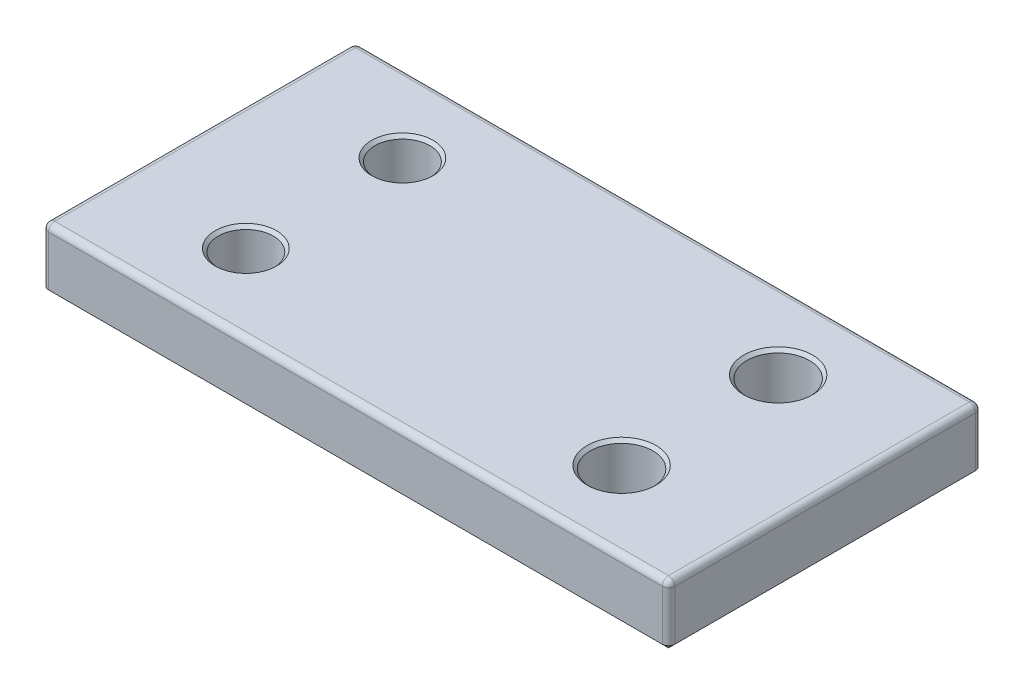
ISO-10303-21;
HEADER;
FILE_DESCRIPTION(('STEP AP214'),'2;1');
FILE_NAME('part.step','',(''),(''),'','','');
FILE_SCHEMA(('AUTOMOTIVE_DESIGN { 1 0 10303 214 1 1 1 1 }'));
ENDSEC;
DATA;
#1=APPLICATION_CONTEXT('core data for automotive mechanical design processes');
#2=APPLICATION_PROTOCOL_DEFINITION('international standard','automotive_design',2000,#1);
#3=PRODUCT_CONTEXT('',#1,'mechanical');
#4=PRODUCT('Part','Part','',(#3));
#5=PRODUCT_RELATED_PRODUCT_CATEGORY('part','',(#4));
#6=PRODUCT_DEFINITION_FORMATION('','',#4);
#7=PRODUCT_DEFINITION_CONTEXT('part definition',#1,'design');
#8=PRODUCT_DEFINITION('design','',#6,#7);
#9=PRODUCT_DEFINITION_SHAPE('','',#8);
#10=(LENGTH_UNIT() NAMED_UNIT(*) SI_UNIT(.MILLI.,.METRE.));
#11=(NAMED_UNIT(*) PLANE_ANGLE_UNIT() SI_UNIT($,.RADIAN.));
#12=(NAMED_UNIT(*) SI_UNIT($,.STERADIAN.) SOLID_ANGLE_UNIT());
#13=UNCERTAINTY_MEASURE_WITH_UNIT(LENGTH_MEASURE(1.E-05),#10,'distance_accuracy_value','');
#14=(GEOMETRIC_REPRESENTATION_CONTEXT(3) GLOBAL_UNCERTAINTY_ASSIGNED_CONTEXT((#13)) GLOBAL_UNIT_ASSIGNED_CONTEXT((#10,
#11,#12)) REPRESENTATION_CONTEXT('',''));
#15=CARTESIAN_POINT('',(0.,0.,0.));
#16=DIRECTION('',(0.,0.,1.));
#17=DIRECTION('',(1.,0.,0.));
#18=AXIS2_PLACEMENT_3D('',#15,#16,#17);
#19=CARTESIAN_POINT('',(-49.,5.,-24.));
#20=DIRECTION('',(0.,-1.,0.));
#21=DIRECTION('',(0.,0.,-1.));
#22=AXIS2_PLACEMENT_3D('',#19,#20,#21);
#23=CYLINDRICAL_SURFACE('',#22,1.);
#24=DIRECTION('',(0.,-1.,0.));
#25=VECTOR('',#24,1.);
#26=CARTESIAN_POINT('',(-49.,5.,-25.));
#27=LINE('',#26,#25);
#28=CARTESIAN_POINT('',(-49.,4.,-25.));
#29=VERTEX_POINT('',#28);
#30=CARTESIAN_POINT('',(-49.,-4.,-25.));
#31=VERTEX_POINT('',#30);
#32=EDGE_CURVE('E206',#29,#31,#27,.T.);
#33=ORIENTED_EDGE('',*,*,#32,.T.);
#34=CARTESIAN_POINT('',(-49.,-4.,-24.));
#35=DIRECTION('',(0.,1.,0.));
#36=DIRECTION('',(0.,0.,1.));
#37=AXIS2_PLACEMENT_3D('',#34,#35,#36);
#38=CIRCLE('',#37,1.);
#39=CARTESIAN_POINT('',(-50.,-4.,-24.));
#40=VERTEX_POINT('',#39);
#41=EDGE_CURVE('E228',#31,#40,#38,.T.);
#42=ORIENTED_EDGE('',*,*,#41,.T.);
#43=DIRECTION('',(0.,-1.,0.));
#44=VECTOR('',#43,1.);
#45=CARTESIAN_POINT('',(-50.,5.,-24.));
#46=LINE('',#45,#44);
#47=CARTESIAN_POINT('',(-50.,4.,-24.));
#48=VERTEX_POINT('',#47);
#49=EDGE_CURVE('E168',#48,#40,#46,.T.);
#50=ORIENTED_EDGE('',*,*,#49,.F.);
#51=CARTESIAN_POINT('',(-49.,4.,-24.));
#52=DIRECTION('',(0.,-1.,0.));
#53=DIRECTION('',(0.,0.,-1.));
#54=AXIS2_PLACEMENT_3D('',#51,#52,#53);
#55=CIRCLE('',#54,1.);
#56=EDGE_CURVE('E155',#48,#29,#55,.T.);
#57=ORIENTED_EDGE('',*,*,#56,.T.);
#58=EDGE_LOOP('',(#33,#42,#50,#57));
#59=FACE_BOUND('',#58,.T.);
#60=ADVANCED_FACE('F45',(#59),#23,.T.);
#61=CARTESIAN_POINT('',(-50.,5.,-24.));
#62=DIRECTION('',(1.,0.,0.));
#63=DIRECTION('',(0.,0.,-1.));
#64=AXIS2_PLACEMENT_3D('',#61,#62,#63);
#65=PLANE('',#64);
#66=ORIENTED_EDGE('',*,*,#49,.T.);
#67=DIRECTION('',(0.,0.,1.));
#68=VECTOR('',#67,1.);
#69=CARTESIAN_POINT('',(-50.,-4.,-24.));
#70=LINE('',#69,#68);
#71=CARTESIAN_POINT('',(-50.,-4.,24.));
#72=VERTEX_POINT('',#71);
#73=EDGE_CURVE('E191',#40,#72,#70,.T.);
#74=ORIENTED_EDGE('',*,*,#73,.T.);
#75=DIRECTION('',(0.,-1.,0.));
#76=VECTOR('',#75,1.);
#77=CARTESIAN_POINT('',(-50.,5.,24.));
#78=LINE('',#77,#76);
#79=CARTESIAN_POINT('',(-50.,4.,24.));
#80=VERTEX_POINT('',#79);
#81=EDGE_CURVE('E441',#80,#72,#78,.T.);
#82=ORIENTED_EDGE('',*,*,#81,.F.);
#83=DIRECTION('',(0.,0.,1.));
#84=VECTOR('',#83,1.);
#85=CARTESIAN_POINT('',(-50.,4.,-24.));
#86=LINE('',#85,#84);
#87=EDGE_CURVE('E189',#80,#48,#86,.F.);
#88=ORIENTED_EDGE('',*,*,#87,.T.);
#89=EDGE_LOOP('',(#66,#74,#82,#88));
#90=FACE_BOUND('',#89,.T.);
#91=ADVANCED_FACE('F292',(#90),#65,.F.);
#92=CARTESIAN_POINT('',(-49.,5.,24.));
#93=DIRECTION('',(0.,-1.,0.));
#94=DIRECTION('',(0.,0.,-1.));
#95=AXIS2_PLACEMENT_3D('',#92,#93,#94);
#96=CYLINDRICAL_SURFACE('',#95,1.);
#97=ORIENTED_EDGE('',*,*,#81,.T.);
#98=CARTESIAN_POINT('',(-49.,-4.,24.));
#99=DIRECTION('',(0.,1.,0.));
#100=DIRECTION('',(0.,0.,1.));
#101=AXIS2_PLACEMENT_3D('',#98,#99,#100);
#102=CIRCLE('',#101,1.);
#103=CARTESIAN_POINT('',(-49.,-4.,25.));
#104=VERTEX_POINT('',#103);
#105=EDGE_CURVE('E218',#72,#104,#102,.T.);
#106=ORIENTED_EDGE('',*,*,#105,.T.);
#107=DIRECTION('',(0.,-1.,0.));
#108=VECTOR('',#107,1.);
#109=CARTESIAN_POINT('',(-49.,5.,25.));
#110=LINE('',#109,#108);
#111=CARTESIAN_POINT('',(-49.,4.,25.));
#112=VERTEX_POINT('',#111);
#113=EDGE_CURVE('E438',#112,#104,#110,.T.);
#114=ORIENTED_EDGE('',*,*,#113,.F.);
#115=CARTESIAN_POINT('',(-49.,4.,24.));
#116=DIRECTION('',(0.,-1.,0.));
#117=DIRECTION('',(0.,0.,-1.));
#118=AXIS2_PLACEMENT_3D('',#115,#116,#117);
#119=CIRCLE('',#118,1.);
#120=EDGE_CURVE('E187',#112,#80,#119,.T.);
#121=ORIENTED_EDGE('',*,*,#120,.T.);
#122=EDGE_LOOP('',(#97,#106,#114,#121));
#123=FACE_BOUND('',#122,.T.);
#124=ADVANCED_FACE('F299',(#123),#96,.T.);
#125=CARTESIAN_POINT('',(49.,5.,25.));
#126=DIRECTION('',(0.,0.,-1.));
#127=DIRECTION('',(-1.,0.,0.));
#128=AXIS2_PLACEMENT_3D('',#125,#126,#127);
#129=PLANE('',#128);
#130=ORIENTED_EDGE('',*,*,#113,.T.);
#131=DIRECTION('',(1.,0.,0.));
#132=VECTOR('',#131,1.);
#133=CARTESIAN_POINT('',(49.,-4.,25.));
#134=LINE('',#133,#132);
#135=CARTESIAN_POINT('',(49.,-4.,25.));
#136=VERTEX_POINT('',#135);
#137=EDGE_CURVE('E220',#104,#136,#134,.T.);
#138=ORIENTED_EDGE('',*,*,#137,.T.);
#139=DIRECTION('',(0.,-1.,0.));
#140=VECTOR('',#139,1.);
#141=CARTESIAN_POINT('',(49.,5.,25.));
#142=LINE('',#141,#140);
#143=CARTESIAN_POINT('',(49.,4.,25.));
#144=VERTEX_POINT('',#143);
#145=EDGE_CURVE('E435',#144,#136,#142,.T.);
#146=ORIENTED_EDGE('',*,*,#145,.F.);
#147=DIRECTION('',(1.,0.,0.));
#148=VECTOR('',#147,1.);
#149=CARTESIAN_POINT('',(-49.,4.,25.));
#150=LINE('',#149,#148);
#151=EDGE_CURVE('E185',#144,#112,#150,.F.);
#152=ORIENTED_EDGE('',*,*,#151,.T.);
#153=EDGE_LOOP('',(#130,#138,#146,#152));
#154=FACE_BOUND('',#153,.T.);
#155=ADVANCED_FACE('F473',(#154),#129,.F.);
#156=CARTESIAN_POINT('',(49.,5.,24.));
#157=DIRECTION('',(0.,-1.,0.));
#158=DIRECTION('',(0.,0.,-1.));
#159=AXIS2_PLACEMENT_3D('',#156,#157,#158);
#160=CYLINDRICAL_SURFACE('',#159,1.);
#161=ORIENTED_EDGE('',*,*,#145,.T.);
#162=CARTESIAN_POINT('',(49.,-4.,24.));
#163=DIRECTION('',(0.,1.,0.));
#164=DIRECTION('',(0.,0.,1.));
#165=AXIS2_PLACEMENT_3D('',#162,#163,#164);
#166=CIRCLE('',#165,1.);
#167=CARTESIAN_POINT('',(50.,-4.,24.));
#168=VERTEX_POINT('',#167);
#169=EDGE_CURVE('E222',#136,#168,#166,.T.);
#170=ORIENTED_EDGE('',*,*,#169,.T.);
#171=DIRECTION('',(0.,-1.,0.));
#172=VECTOR('',#171,1.);
#173=CARTESIAN_POINT('',(50.,5.,24.));
#174=LINE('',#173,#172);
#175=CARTESIAN_POINT('',(50.,4.,24.));
#176=VERTEX_POINT('',#175);
#177=EDGE_CURVE('E432',#176,#168,#174,.T.);
#178=ORIENTED_EDGE('',*,*,#177,.F.);
#179=CARTESIAN_POINT('',(49.,4.,24.));
#180=DIRECTION('',(0.,-1.,0.));
#181=DIRECTION('',(0.,0.,-1.));
#182=AXIS2_PLACEMENT_3D('',#179,#180,#181);
#183=CIRCLE('',#182,1.);
#184=EDGE_CURVE('E183',#176,#144,#183,.T.);
#185=ORIENTED_EDGE('',*,*,#184,.T.);
#186=EDGE_LOOP('',(#161,#170,#178,#185));
#187=FACE_BOUND('',#186,.T.);
#188=ADVANCED_FACE('F466',(#187),#160,.T.);
#189=CARTESIAN_POINT('',(50.,5.,-24.));
#190=DIRECTION('',(-1.,0.,0.));
#191=DIRECTION('',(0.,0.,1.));
#192=AXIS2_PLACEMENT_3D('',#189,#190,#191);
#193=PLANE('',#192);
#194=ORIENTED_EDGE('',*,*,#177,.T.);
#195=DIRECTION('',(0.,0.,-1.));
#196=VECTOR('',#195,1.);
#197=CARTESIAN_POINT('',(50.,-4.,-24.));
#198=LINE('',#197,#196);
#199=CARTESIAN_POINT('',(50.,-4.,-24.));
#200=VERTEX_POINT('',#199);
#201=EDGE_CURVE('E224',#168,#200,#198,.T.);
#202=ORIENTED_EDGE('',*,*,#201,.T.);
#203=DIRECTION('',(0.,-1.,0.));
#204=VECTOR('',#203,1.);
#205=CARTESIAN_POINT('',(50.,5.,-24.));
#206=LINE('',#205,#204);
#207=CARTESIAN_POINT('',(50.,4.,-24.));
#208=VERTEX_POINT('',#207);
#209=EDGE_CURVE('E430',#208,#200,#206,.T.);
#210=ORIENTED_EDGE('',*,*,#209,.F.);
#211=DIRECTION('',(0.,0.,-1.));
#212=VECTOR('',#211,1.);
#213=CARTESIAN_POINT('',(50.,4.,24.));
#214=LINE('',#213,#212);
#215=EDGE_CURVE('E181',#208,#176,#214,.F.);
#216=ORIENTED_EDGE('',*,*,#215,.T.);
#217=EDGE_LOOP('',(#194,#202,#210,#216));
#218=FACE_BOUND('',#217,.T.);
#219=ADVANCED_FACE('F459',(#218),#193,.F.);
#220=CARTESIAN_POINT('',(49.,5.,-24.));
#221=DIRECTION('',(0.,-1.,0.));
#222=DIRECTION('',(0.,0.,-1.));
#223=AXIS2_PLACEMENT_3D('',#220,#221,#222);
#224=CYLINDRICAL_SURFACE('',#223,1.);
#225=ORIENTED_EDGE('',*,*,#209,.T.);
#226=CARTESIAN_POINT('',(49.,-4.,-24.));
#227=DIRECTION('',(0.,1.,0.));
#228=DIRECTION('',(0.,0.,1.));
#229=AXIS2_PLACEMENT_3D('',#226,#227,#228);
#230=CIRCLE('',#229,1.);
#231=CARTESIAN_POINT('',(49.,-4.,-25.));
#232=VERTEX_POINT('',#231);
#233=EDGE_CURVE('E69',#200,#232,#230,.T.);
#234=ORIENTED_EDGE('',*,*,#233,.T.);
#235=DIRECTION('',(0.,-1.,0.));
#236=VECTOR('',#235,1.);
#237=CARTESIAN_POINT('',(49.,5.,-25.));
#238=LINE('',#237,#236);
#239=CARTESIAN_POINT('',(49.,4.,-25.));
#240=VERTEX_POINT('',#239);
#241=EDGE_CURVE('E428',#240,#232,#238,.T.);
#242=ORIENTED_EDGE('',*,*,#241,.F.);
#243=CARTESIAN_POINT('',(49.,4.,-24.));
#244=DIRECTION('',(0.,-1.,0.));
#245=DIRECTION('',(0.,0.,-1.));
#246=AXIS2_PLACEMENT_3D('',#243,#244,#245);
#247=CIRCLE('',#246,1.);
#248=EDGE_CURVE('E175',#240,#208,#247,.T.);
#249=ORIENTED_EDGE('',*,*,#248,.T.);
#250=EDGE_LOOP('',(#225,#234,#242,#249));
#251=FACE_BOUND('',#250,.T.);
#252=ADVANCED_FACE('F456',(#251),#224,.T.);
#253=CARTESIAN_POINT('',(49.,5.,-25.));
#254=DIRECTION('',(0.,0.,1.));
#255=DIRECTION('',(1.,0.,0.));
#256=AXIS2_PLACEMENT_3D('',#253,#254,#255);
#257=PLANE('',#256);
#258=ORIENTED_EDGE('',*,*,#241,.T.);
#259=DIRECTION('',(-1.,0.,0.));
#260=VECTOR('',#259,1.);
#261=CARTESIAN_POINT('',(49.,-4.,-25.));
#262=LINE('',#261,#260);
#263=EDGE_CURVE('E61',#232,#31,#262,.T.);
#264=ORIENTED_EDGE('',*,*,#263,.T.);
#265=ORIENTED_EDGE('',*,*,#32,.F.);
#266=DIRECTION('',(-1.,0.,0.));
#267=VECTOR('',#266,1.);
#268=CARTESIAN_POINT('',(49.,4.,-25.));
#269=LINE('',#268,#267);
#270=EDGE_CURVE('E145',#29,#240,#269,.F.);
#271=ORIENTED_EDGE('',*,*,#270,.T.);
#272=EDGE_LOOP('',(#258,#264,#265,#271));
#273=FACE_BOUND('',#272,.T.);
#274=ADVANCED_FACE('F454',(#273),#257,.F.);
#275=CARTESIAN_POINT('',(-49.,5.,-24.));
#276=DIRECTION('',(0.,1.,0.));
#277=DIRECTION('',(0.,0.,1.));
#278=AXIS2_PLACEMENT_3D('',#275,#276,#277);
#279=PLANE('',#278);
#280=CARTESIAN_POINT('',(30.,5.,12.5));
#281=DIRECTION('',(0.,1.,0.));
#282=DIRECTION('',(0.,0.,1.));
#283=AXIS2_PLACEMENT_3D('',#280,#281,#282);
#284=CIRCLE('',#283,5.49999999999998);
#285=CARTESIAN_POINT('',(30.,5.,18.));
#286=VERTEX_POINT('',#285);
#287=EDGE_CURVE('E264',#286,#286,#284,.F.);
#288=ORIENTED_EDGE('',*,*,#287,.T.);
#289=EDGE_LOOP('',(#288));
#290=FACE_BOUND('',#289,.T.);
#291=CARTESIAN_POINT('',(30.,5.,-12.5));
#292=DIRECTION('',(0.,1.,0.));
#293=DIRECTION('',(0.,0.,1.));
#294=AXIS2_PLACEMENT_3D('',#291,#292,#293);
#295=CIRCLE('',#294,5.49999999999999);
#296=CARTESIAN_POINT('',(30.,5.,-7.00000000000001));
#297=VERTEX_POINT('',#296);
#298=EDGE_CURVE('E261',#297,#297,#295,.F.);
#299=ORIENTED_EDGE('',*,*,#298,.T.);
#300=EDGE_LOOP('',(#299));
#301=FACE_BOUND('',#300,.T.);
#302=CARTESIAN_POINT('',(-30.,5.,12.5));
#303=DIRECTION('',(0.,1.,0.));
#304=DIRECTION('',(0.,0.,1.));
#305=AXIS2_PLACEMENT_3D('',#302,#303,#304);
#306=CIRCLE('',#305,4.89999999999996);
#307=CARTESIAN_POINT('',(-30.,5.,17.4));
#308=VERTEX_POINT('',#307);
#309=EDGE_CURVE('E258',#308,#308,#306,.F.);
#310=ORIENTED_EDGE('',*,*,#309,.T.);
#311=EDGE_LOOP('',(#310));
#312=FACE_BOUND('',#311,.T.);
#313=CARTESIAN_POINT('',(-30.,5.,-12.5));
#314=DIRECTION('',(0.,1.,0.));
#315=DIRECTION('',(0.,0.,1.));
#316=AXIS2_PLACEMENT_3D('',#313,#314,#315);
#317=CIRCLE('',#316,4.89999999999996);
#318=CARTESIAN_POINT('',(-30.,5.,-7.60000000000004));
#319=VERTEX_POINT('',#318);
#320=EDGE_CURVE('E255',#319,#319,#317,.F.);
#321=ORIENTED_EDGE('',*,*,#320,.T.);
#322=EDGE_LOOP('',(#321));
#323=FACE_BOUND('',#322,.T.);
#324=DIRECTION('',(0.,0.,-1.));
#325=VECTOR('',#324,1.);
#326=CARTESIAN_POINT('',(49.,5.,-24.));
#327=LINE('',#326,#325);
#328=CARTESIAN_POINT('',(49.,5.,24.));
#329=VERTEX_POINT('',#328);
#330=CARTESIAN_POINT('',(49.,5.,-24.));
#331=VERTEX_POINT('',#330);
#332=EDGE_CURVE('E172',#329,#331,#327,.T.);
#333=ORIENTED_EDGE('',*,*,#332,.T.);
#334=DIRECTION('',(-1.,0.,0.));
#335=VECTOR('',#334,1.);
#336=CARTESIAN_POINT('',(-49.,5.,-24.));
#337=LINE('',#336,#335);
#338=CARTESIAN_POINT('',(-49.,5.,-24.));
#339=VERTEX_POINT('',#338);
#340=EDGE_CURVE('E143',#331,#339,#337,.T.);
#341=ORIENTED_EDGE('',*,*,#340,.T.);
#342=DIRECTION('',(0.,0.,1.));
#343=VECTOR('',#342,1.);
#344=CARTESIAN_POINT('',(-49.,5.,24.));
#345=LINE('',#344,#343);
#346=CARTESIAN_POINT('',(-49.,5.,24.));
#347=VERTEX_POINT('',#346);
#348=EDGE_CURVE('E161',#339,#347,#345,.T.);
#349=ORIENTED_EDGE('',*,*,#348,.T.);
#350=DIRECTION('',(1.,0.,0.));
#351=VECTOR('',#350,1.);
#352=CARTESIAN_POINT('',(49.,5.,24.));
#353=LINE('',#352,#351);
#354=EDGE_CURVE('E167',#347,#329,#353,.T.);
#355=ORIENTED_EDGE('',*,*,#354,.T.);
#356=EDGE_LOOP('',(#333,#341,#349,#355));
#357=FACE_BOUND('',#356,.T.);
#358=ADVANCED_FACE('F170',(#290,#301,#312,#323,#357),#279,.T.);
#359=CARTESIAN_POINT('',(-49.,-5.,-24.));
#360=DIRECTION('',(0.,1.,0.));
#361=DIRECTION('',(0.,0.,1.));
#362=AXIS2_PLACEMENT_3D('',#359,#360,#361);
#363=PLANE('',#362);
#364=CARTESIAN_POINT('',(30.,-5.,-12.5));
#365=DIRECTION('',(0.,1.,0.));
#366=DIRECTION('',(0.,0.,1.));
#367=AXIS2_PLACEMENT_3D('',#364,#365,#366);
#368=CIRCLE('',#367,5.);
#369=CARTESIAN_POINT('',(30.,-5.,-7.5));
#370=VERTEX_POINT('',#369);
#371=EDGE_CURVE('E418',#370,#370,#368,.T.);
#372=ORIENTED_EDGE('',*,*,#371,.T.);
#373=EDGE_LOOP('',(#372));
#374=FACE_BOUND('',#373,.T.);
#375=CARTESIAN_POINT('',(30.,-5.,12.5));
#376=DIRECTION('',(0.,1.,0.));
#377=DIRECTION('',(0.,0.,1.));
#378=AXIS2_PLACEMENT_3D('',#375,#376,#377);
#379=CIRCLE('',#378,5.);
#380=CARTESIAN_POINT('',(30.,-5.,17.5));
#381=VERTEX_POINT('',#380);
#382=EDGE_CURVE('E415',#381,#381,#379,.T.);
#383=ORIENTED_EDGE('',*,*,#382,.T.);
#384=EDGE_LOOP('',(#383));
#385=FACE_BOUND('',#384,.T.);
#386=CARTESIAN_POINT('',(-30.,-5.,-12.5));
#387=DIRECTION('',(0.,1.,0.));
#388=DIRECTION('',(0.,0.,1.));
#389=AXIS2_PLACEMENT_3D('',#386,#387,#388);
#390=CIRCLE('',#389,4.39999999999999);
#391=CARTESIAN_POINT('',(-30.,-5.,-8.10000000000001));
#392=VERTEX_POINT('',#391);
#393=EDGE_CURVE('E417',#392,#392,#390,.T.);
#394=ORIENTED_EDGE('',*,*,#393,.T.);
#395=EDGE_LOOP('',(#394));
#396=FACE_BOUND('',#395,.T.);
#397=CARTESIAN_POINT('',(-30.,-5.,12.5));
#398=DIRECTION('',(0.,1.,0.));
#399=DIRECTION('',(0.,0.,1.));
#400=AXIS2_PLACEMENT_3D('',#397,#398,#399);
#401=CIRCLE('',#400,4.39999999999999);
#402=CARTESIAN_POINT('',(-30.,-5.,16.9));
#403=VERTEX_POINT('',#402);
#404=EDGE_CURVE('E234',#403,#403,#401,.T.);
#405=ORIENTED_EDGE('',*,*,#404,.T.);
#406=EDGE_LOOP('',(#405));
#407=FACE_BOUND('',#406,.T.);
#408=DIRECTION('',(-1.,0.,0.));
#409=VECTOR('',#408,1.);
#410=CARTESIAN_POINT('',(-49.,-5.,24.));
#411=LINE('',#410,#409);
#412=CARTESIAN_POINT('',(49.,-5.,24.));
#413=VERTEX_POINT('',#412);
#414=CARTESIAN_POINT('',(-49.,-5.,24.));
#415=VERTEX_POINT('',#414);
#416=EDGE_CURVE('E213',#413,#415,#411,.T.);
#417=ORIENTED_EDGE('',*,*,#416,.T.);
#418=DIRECTION('',(0.,0.,-1.));
#419=VECTOR('',#418,1.);
#420=CARTESIAN_POINT('',(-49.,-5.,-24.));
#421=LINE('',#420,#419);
#422=CARTESIAN_POINT('',(-49.,-5.,-24.));
#423=VERTEX_POINT('',#422);
#424=EDGE_CURVE('E215',#415,#423,#421,.T.);
#425=ORIENTED_EDGE('',*,*,#424,.T.);
#426=DIRECTION('',(1.,0.,0.));
#427=VECTOR('',#426,1.);
#428=CARTESIAN_POINT('',(-49.,-5.,-24.));
#429=LINE('',#428,#427);
#430=CARTESIAN_POINT('',(49.,-5.,-24.));
#431=VERTEX_POINT('',#430);
#432=EDGE_CURVE('E209',#423,#431,#429,.T.);
#433=ORIENTED_EDGE('',*,*,#432,.T.);
#434=DIRECTION('',(0.,0.,1.));
#435=VECTOR('',#434,1.);
#436=CARTESIAN_POINT('',(49.,-5.,-24.));
#437=LINE('',#436,#435);
#438=EDGE_CURVE('E211',#431,#413,#437,.T.);
#439=ORIENTED_EDGE('',*,*,#438,.T.);
#440=EDGE_LOOP('',(#417,#425,#433,#439));
#441=FACE_BOUND('',#440,.T.);
#442=ADVANCED_FACE('F329',(#374,#385,#396,#407,#441),#363,.F.);
#443=CARTESIAN_POINT('',(-49.,4.,24.));
#444=DIRECTION('',(-1.,0.,0.));
#445=DIRECTION('',(0.,0.,1.));
#446=AXIS2_PLACEMENT_3D('',#443,#444,#445);
#447=CYLINDRICAL_SURFACE('',#446,1.);
#448=CARTESIAN_POINT('',(-49.,4.,24.));
#449=DIRECTION('',(-1.,0.,0.));
#450=DIRECTION('',(0.,0.,1.));
#451=AXIS2_PLACEMENT_3D('',#448,#449,#450);
#452=CIRCLE('',#451,1.);
#453=EDGE_CURVE('E200',#112,#347,#452,.T.);
#454=ORIENTED_EDGE('',*,*,#453,.F.);
#455=ORIENTED_EDGE('',*,*,#151,.F.);
#456=CARTESIAN_POINT('',(49.,4.,24.));
#457=DIRECTION('',(1.,0.,0.));
#458=DIRECTION('',(0.,0.,-1.));
#459=AXIS2_PLACEMENT_3D('',#456,#457,#458);
#460=CIRCLE('',#459,1.);
#461=EDGE_CURVE('E203',#329,#144,#460,.T.);
#462=ORIENTED_EDGE('',*,*,#461,.F.);
#463=ORIENTED_EDGE('',*,*,#354,.F.);
#464=EDGE_LOOP('',(#454,#455,#462,#463));
#465=FACE_BOUND('',#464,.T.);
#466=ADVANCED_FACE('F325',(#465),#447,.T.);
#467=CARTESIAN_POINT('',(49.,4.,24.));
#468=DIRECTION('',(0.,1.,0.));
#469=DIRECTION('',(0.,0.,1.));
#470=AXIS2_PLACEMENT_3D('',#467,#468,#469);
#471=SPHERICAL_SURFACE('',#470,1.);
#472=ORIENTED_EDGE('',*,*,#461,.T.);
#473=ORIENTED_EDGE('',*,*,#184,.F.);
#474=CARTESIAN_POINT('',(49.,4.,24.));
#475=DIRECTION('',(0.,0.,-1.));
#476=DIRECTION('',(-1.,0.,0.));
#477=AXIS2_PLACEMENT_3D('',#474,#475,#476);
#478=CIRCLE('',#477,1.);
#479=EDGE_CURVE('E197',#329,#176,#478,.T.);
#480=ORIENTED_EDGE('',*,*,#479,.F.);
#481=EDGE_LOOP('',(#472,#473,#480));
#482=FACE_BOUND('',#481,.T.);
#483=ADVANCED_FACE('F321',(#482),#471,.T.);
#484=CARTESIAN_POINT('',(-49.,4.,24.));
#485=DIRECTION('',(0.,1.,0.));
#486=DIRECTION('',(0.,0.,1.));
#487=AXIS2_PLACEMENT_3D('',#484,#485,#486);
#488=SPHERICAL_SURFACE('',#487,1.);
#489=ORIENTED_EDGE('',*,*,#120,.F.);
#490=ORIENTED_EDGE('',*,*,#453,.T.);
#491=CARTESIAN_POINT('',(-49.,4.,24.));
#492=DIRECTION('',(0.,0.,-1.));
#493=DIRECTION('',(-1.,0.,0.));
#494=AXIS2_PLACEMENT_3D('',#491,#492,#493);
#495=CIRCLE('',#494,1.);
#496=EDGE_CURVE('E164',#80,#347,#495,.T.);
#497=ORIENTED_EDGE('',*,*,#496,.F.);
#498=EDGE_LOOP('',(#489,#490,#497));
#499=FACE_BOUND('',#498,.T.);
#500=ADVANCED_FACE('F317',(#499),#488,.T.);
#501=CARTESIAN_POINT('',(49.,4.,-24.));
#502=DIRECTION('',(0.,0.,1.));
#503=DIRECTION('',(1.,0.,0.));
#504=AXIS2_PLACEMENT_3D('',#501,#502,#503);
#505=CYLINDRICAL_SURFACE('',#504,1.);
#506=ORIENTED_EDGE('',*,*,#479,.T.);
#507=ORIENTED_EDGE('',*,*,#215,.F.);
#508=CARTESIAN_POINT('',(49.,4.,-24.));
#509=DIRECTION('',(0.,0.,-1.));
#510=DIRECTION('',(-1.,0.,0.));
#511=AXIS2_PLACEMENT_3D('',#508,#509,#510);
#512=CIRCLE('',#511,1.);
#513=EDGE_CURVE('E158',#331,#208,#512,.T.);
#514=ORIENTED_EDGE('',*,*,#513,.F.);
#515=ORIENTED_EDGE('',*,*,#332,.F.);
#516=EDGE_LOOP('',(#506,#507,#514,#515));
#517=FACE_BOUND('',#516,.T.);
#518=ADVANCED_FACE('F314',(#517),#505,.T.);
#519=CARTESIAN_POINT('',(-49.,4.,-24.));
#520=DIRECTION('',(0.,0.,-1.));
#521=DIRECTION('',(-1.,0.,0.));
#522=AXIS2_PLACEMENT_3D('',#519,#520,#521);
#523=CYLINDRICAL_SURFACE('',#522,1.);
#524=ORIENTED_EDGE('',*,*,#496,.T.);
#525=ORIENTED_EDGE('',*,*,#348,.F.);
#526=CARTESIAN_POINT('',(-49.,4.,-24.));
#527=DIRECTION('',(0.,0.,-1.));
#528=DIRECTION('',(-1.,0.,0.));
#529=AXIS2_PLACEMENT_3D('',#526,#527,#528);
#530=CIRCLE('',#529,1.);
#531=EDGE_CURVE('E152',#48,#339,#530,.T.);
#532=ORIENTED_EDGE('',*,*,#531,.F.);
#533=ORIENTED_EDGE('',*,*,#87,.F.);
#534=EDGE_LOOP('',(#524,#525,#532,#533));
#535=FACE_BOUND('',#534,.T.);
#536=ADVANCED_FACE('F162',(#535),#523,.T.);
#537=CARTESIAN_POINT('',(49.,4.,-24.));
#538=DIRECTION('',(0.,1.,0.));
#539=DIRECTION('',(0.,0.,1.));
#540=AXIS2_PLACEMENT_3D('',#537,#538,#539);
#541=SPHERICAL_SURFACE('',#540,1.);
#542=ORIENTED_EDGE('',*,*,#513,.T.);
#543=ORIENTED_EDGE('',*,*,#248,.F.);
#544=CARTESIAN_POINT('',(49.,4.,-24.));
#545=DIRECTION('',(-1.,0.,0.));
#546=DIRECTION('',(0.,0.,1.));
#547=AXIS2_PLACEMENT_3D('',#544,#545,#546);
#548=CIRCLE('',#547,1.);
#549=EDGE_CURVE('E148',#331,#240,#548,.T.);
#550=ORIENTED_EDGE('',*,*,#549,.F.);
#551=EDGE_LOOP('',(#542,#543,#550));
#552=FACE_BOUND('',#551,.T.);
#553=ADVANCED_FACE('F308',(#552),#541,.T.);
#554=CARTESIAN_POINT('',(-49.,4.,-24.));
#555=DIRECTION('',(0.,1.,0.));
#556=DIRECTION('',(0.,0.,1.));
#557=AXIS2_PLACEMENT_3D('',#554,#555,#556);
#558=SPHERICAL_SURFACE('',#557,1.);
#559=ORIENTED_EDGE('',*,*,#56,.F.);
#560=ORIENTED_EDGE('',*,*,#531,.T.);
#561=CARTESIAN_POINT('',(-49.,4.,-24.));
#562=DIRECTION('',(1.,0.,0.));
#563=DIRECTION('',(0.,0.,-1.));
#564=AXIS2_PLACEMENT_3D('',#561,#562,#563);
#565=CIRCLE('',#564,1.);
#566=EDGE_CURVE('E139',#29,#339,#565,.T.);
#567=ORIENTED_EDGE('',*,*,#566,.F.);
#568=EDGE_LOOP('',(#559,#560,#567));
#569=FACE_BOUND('',#568,.T.);
#570=ADVANCED_FACE('F154',(#569),#558,.T.);
#571=CARTESIAN_POINT('',(-49.,4.,-24.));
#572=DIRECTION('',(1.,0.,0.));
#573=DIRECTION('',(0.,0.,-1.));
#574=AXIS2_PLACEMENT_3D('',#571,#572,#573);
#575=CYLINDRICAL_SURFACE('',#574,1.);
#576=ORIENTED_EDGE('',*,*,#549,.T.);
#577=ORIENTED_EDGE('',*,*,#270,.F.);
#578=ORIENTED_EDGE('',*,*,#566,.T.);
#579=ORIENTED_EDGE('',*,*,#340,.F.);
#580=EDGE_LOOP('',(#576,#577,#578,#579));
#581=FACE_BOUND('',#580,.T.);
#582=ADVANCED_FACE('F141',(#581),#575,.T.);
#583=CARTESIAN_POINT('',(50.,-4.,-24.));
#584=DIRECTION('',(-0.707106781186546,0.707106781186549,0.));
#585=DIRECTION('',(0.,0.,-1.));
#586=AXIS2_PLACEMENT_3D('',#583,#584,#585);
#587=PLANE('',#586);
#588=DIRECTION('',(-0.707106781186549,-0.707106781186546,0.));
#589=VECTOR('',#588,1.);
#590=CARTESIAN_POINT('',(50.,-4.,-24.));
#591=LINE('',#590,#589);
#592=EDGE_CURVE('E149',#200,#431,#591,.T.);
#593=ORIENTED_EDGE('',*,*,#592,.F.);
#594=ORIENTED_EDGE('',*,*,#201,.F.);
#595=DIRECTION('',(0.707106781186549,0.707106781186546,0.));
#596=VECTOR('',#595,1.);
#597=CARTESIAN_POINT('',(49.,-5.,24.));
#598=LINE('',#597,#596);
#599=EDGE_CURVE('E248',#413,#168,#598,.T.);
#600=ORIENTED_EDGE('',*,*,#599,.F.);
#601=ORIENTED_EDGE('',*,*,#438,.F.);
#602=EDGE_LOOP('',(#593,#594,#600,#601));
#603=FACE_BOUND('',#602,.T.);
#604=ADVANCED_FACE('F305',(#603),#587,.F.);
#605=CARTESIAN_POINT('',(49.,-4.,-24.));
#606=DIRECTION('',(0.,1.,0.));
#607=DIRECTION('',(0.,0.,1.));
#608=AXIS2_PLACEMENT_3D('',#605,#606,#607);
#609=CONICAL_SURFACE('',#608,1.,0.78539816339745);
#610=ORIENTED_EDGE('',*,*,#233,.F.);
#611=ORIENTED_EDGE('',*,*,#592,.T.);
#612=DIRECTION('',(0.,-0.707106781186546,0.707106781186549));
#613=VECTOR('',#612,1.);
#614=CARTESIAN_POINT('',(49.,-4.,-25.));
#615=LINE('',#614,#613);
#616=EDGE_CURVE('E245',#232,#431,#615,.T.);
#617=ORIENTED_EDGE('',*,*,#616,.F.);
#618=EDGE_LOOP('',(#610,#611,#617));
#619=FACE_BOUND('',#618,.T.);
#620=ADVANCED_FACE('F374',(#619),#609,.T.);
#621=CARTESIAN_POINT('',(49.,-4.,24.));
#622=DIRECTION('',(0.,1.,0.));
#623=DIRECTION('',(0.,0.,1.));
#624=AXIS2_PLACEMENT_3D('',#621,#622,#623);
#625=CONICAL_SURFACE('',#624,1.,0.78539816339745);
#626=ORIENTED_EDGE('',*,*,#599,.T.);
#627=ORIENTED_EDGE('',*,*,#169,.F.);
#628=DIRECTION('',(0.,0.707106781186546,0.707106781186549));
#629=VECTOR('',#628,1.);
#630=CARTESIAN_POINT('',(49.,-5.,24.));
#631=LINE('',#630,#629);
#632=EDGE_CURVE('E242',#413,#136,#631,.T.);
#633=ORIENTED_EDGE('',*,*,#632,.F.);
#634=EDGE_LOOP('',(#626,#627,#633));
#635=FACE_BOUND('',#634,.T.);
#636=ADVANCED_FACE('F367',(#635),#625,.T.);
#637=CARTESIAN_POINT('',(49.,-4.,-25.));
#638=DIRECTION('',(0.,0.707106781186549,0.707106781186546));
#639=DIRECTION('',(-1.,0.,0.));
#640=AXIS2_PLACEMENT_3D('',#637,#638,#639);
#641=PLANE('',#640);
#642=ORIENTED_EDGE('',*,*,#616,.T.);
#643=ORIENTED_EDGE('',*,*,#432,.F.);
#644=DIRECTION('',(0.,-0.707106781186546,0.707106781186549));
#645=VECTOR('',#644,1.);
#646=CARTESIAN_POINT('',(-49.,-4.,-25.));
#647=LINE('',#646,#645);
#648=EDGE_CURVE('E239',#31,#423,#647,.T.);
#649=ORIENTED_EDGE('',*,*,#648,.F.);
#650=ORIENTED_EDGE('',*,*,#263,.F.);
#651=EDGE_LOOP('',(#642,#643,#649,#650));
#652=FACE_BOUND('',#651,.T.);
#653=ADVANCED_FACE('F360',(#652),#641,.F.);
#654=CARTESIAN_POINT('',(49.,-4.,25.));
#655=DIRECTION('',(0.,0.707106781186549,-0.707106781186546));
#656=DIRECTION('',(1.,0.,0.));
#657=AXIS2_PLACEMENT_3D('',#654,#655,#656);
#658=PLANE('',#657);
#659=ORIENTED_EDGE('',*,*,#632,.T.);
#660=ORIENTED_EDGE('',*,*,#137,.F.);
#661=DIRECTION('',(0.,0.707106781186546,0.707106781186549));
#662=VECTOR('',#661,1.);
#663=CARTESIAN_POINT('',(-49.,-5.,24.));
#664=LINE('',#663,#662);
#665=EDGE_CURVE('E236',#415,#104,#664,.T.);
#666=ORIENTED_EDGE('',*,*,#665,.F.);
#667=ORIENTED_EDGE('',*,*,#416,.F.);
#668=EDGE_LOOP('',(#659,#660,#666,#667));
#669=FACE_BOUND('',#668,.T.);
#670=ADVANCED_FACE('F353',(#669),#658,.F.);
#671=CARTESIAN_POINT('',(-49.,-4.,-24.));
#672=DIRECTION('',(0.,1.,0.));
#673=DIRECTION('',(0.,0.,1.));
#674=AXIS2_PLACEMENT_3D('',#671,#672,#673);
#675=CONICAL_SURFACE('',#674,1.,0.78539816339745);
#676=ORIENTED_EDGE('',*,*,#41,.F.);
#677=ORIENTED_EDGE('',*,*,#648,.T.);
#678=DIRECTION('',(0.707106781186549,-0.707106781186546,0.));
#679=VECTOR('',#678,1.);
#680=CARTESIAN_POINT('',(-50.,-4.,-24.));
#681=LINE('',#680,#679);
#682=EDGE_CURVE('E233',#40,#423,#681,.T.);
#683=ORIENTED_EDGE('',*,*,#682,.F.);
#684=EDGE_LOOP('',(#676,#677,#683));
#685=FACE_BOUND('',#684,.T.);
#686=ADVANCED_FACE('F346',(#685),#675,.T.);
#687=CARTESIAN_POINT('',(-49.,-4.,24.));
#688=DIRECTION('',(0.,1.,0.));
#689=DIRECTION('',(0.,0.,1.));
#690=AXIS2_PLACEMENT_3D('',#687,#688,#689);
#691=CONICAL_SURFACE('',#690,1.,0.78539816339745);
#692=ORIENTED_EDGE('',*,*,#665,.T.);
#693=ORIENTED_EDGE('',*,*,#105,.F.);
#694=DIRECTION('',(-0.707106781186549,0.707106781186546,0.));
#695=VECTOR('',#694,1.);
#696=CARTESIAN_POINT('',(-49.,-5.,24.));
#697=LINE('',#696,#695);
#698=EDGE_CURVE('E231',#415,#72,#697,.T.);
#699=ORIENTED_EDGE('',*,*,#698,.F.);
#700=EDGE_LOOP('',(#692,#693,#699));
#701=FACE_BOUND('',#700,.T.);
#702=ADVANCED_FACE('F339',(#701),#691,.T.);
#703=CARTESIAN_POINT('',(-50.,-4.,-24.));
#704=DIRECTION('',(0.707106781186546,0.707106781186549,0.));
#705=DIRECTION('',(0.,0.,1.));
#706=AXIS2_PLACEMENT_3D('',#703,#704,#705);
#707=PLANE('',#706);
#708=ORIENTED_EDGE('',*,*,#682,.T.);
#709=ORIENTED_EDGE('',*,*,#424,.F.);
#710=ORIENTED_EDGE('',*,*,#698,.T.);
#711=ORIENTED_EDGE('',*,*,#73,.F.);
#712=EDGE_LOOP('',(#708,#709,#710,#711));
#713=FACE_BOUND('',#712,.T.);
#714=ADVANCED_FACE('F332',(#713),#707,.F.);
#715=CARTESIAN_POINT('',(-30.,5.,12.5));
#716=DIRECTION('',(0.,1.,0.));
#717=DIRECTION('',(0.,0.,1.));
#718=AXIS2_PLACEMENT_3D('',#715,#716,#717);
#719=CYLINDRICAL_SURFACE('',#718,4.39999999999999);
#720=CARTESIAN_POINT('',(-30.,4.50000000000003,12.5));
#721=DIRECTION('',(0.,1.,0.));
#722=DIRECTION('',(0.,0.,1.));
#723=AXIS2_PLACEMENT_3D('',#720,#721,#722);
#724=CIRCLE('',#723,4.39999999999999);
#725=CARTESIAN_POINT('',(-30.,4.50000000000003,16.9));
#726=VERTEX_POINT('',#725);
#727=EDGE_CURVE('E54',#726,#726,#724,.T.);
#728=ORIENTED_EDGE('',*,*,#727,.T.);
#729=EDGE_LOOP('',(#728));
#730=FACE_BOUND('',#729,.T.);
#731=ORIENTED_EDGE('',*,*,#404,.F.);
#732=EDGE_LOOP('',(#731));
#733=FACE_BOUND('',#732,.T.);
#734=ADVANCED_FACE('F272',(#730,#733),#719,.F.);
#735=CARTESIAN_POINT('',(-30.,5.,-12.5));
#736=DIRECTION('',(0.,1.,0.));
#737=DIRECTION('',(0.,0.,1.));
#738=AXIS2_PLACEMENT_3D('',#735,#736,#737);
#739=CYLINDRICAL_SURFACE('',#738,4.39999999999999);
#740=CARTESIAN_POINT('',(-30.,4.50000000000003,-12.5));
#741=DIRECTION('',(0.,1.,0.));
#742=DIRECTION('',(0.,0.,1.));
#743=AXIS2_PLACEMENT_3D('',#740,#741,#742);
#744=CIRCLE('',#743,4.39999999999999);
#745=CARTESIAN_POINT('',(-30.,4.50000000000003,-8.10000000000001));
#746=VERTEX_POINT('',#745);
#747=EDGE_CURVE('E11',#746,#746,#744,.T.);
#748=ORIENTED_EDGE('',*,*,#747,.T.);
#749=EDGE_LOOP('',(#748));
#750=FACE_BOUND('',#749,.T.);
#751=ORIENTED_EDGE('',*,*,#393,.F.);
#752=EDGE_LOOP('',(#751));
#753=FACE_BOUND('',#752,.T.);
#754=ADVANCED_FACE('F411',(#750,#753),#739,.F.);
#755=CARTESIAN_POINT('',(30.,5.,12.5));
#756=DIRECTION('',(0.,1.,0.));
#757=DIRECTION('',(0.,0.,1.));
#758=AXIS2_PLACEMENT_3D('',#755,#756,#757);
#759=CYLINDRICAL_SURFACE('',#758,5.);
#760=CARTESIAN_POINT('',(30.,4.50000000000003,12.5));
#761=DIRECTION('',(0.,1.,0.));
#762=DIRECTION('',(0.,0.,1.));
#763=AXIS2_PLACEMENT_3D('',#760,#761,#762);
#764=CIRCLE('',#763,5.);
#765=CARTESIAN_POINT('',(30.,4.50000000000003,17.5));
#766=VERTEX_POINT('',#765);
#767=EDGE_CURVE('E230',#766,#766,#764,.T.);
#768=ORIENTED_EDGE('',*,*,#767,.T.);
#769=EDGE_LOOP('',(#768));
#770=FACE_BOUND('',#769,.T.);
#771=ORIENTED_EDGE('',*,*,#382,.F.);
#772=EDGE_LOOP('',(#771));
#773=FACE_BOUND('',#772,.T.);
#774=ADVANCED_FACE('F402',(#770,#773),#759,.F.);
#775=CARTESIAN_POINT('',(30.,5.,-12.5));
#776=DIRECTION('',(0.,1.,0.));
#777=DIRECTION('',(0.,0.,1.));
#778=AXIS2_PLACEMENT_3D('',#775,#776,#777);
#779=CYLINDRICAL_SURFACE('',#778,5.);
#780=CARTESIAN_POINT('',(30.,4.5,-12.5));
#781=DIRECTION('',(0.,1.,0.));
#782=DIRECTION('',(0.,0.,1.));
#783=AXIS2_PLACEMENT_3D('',#780,#781,#782);
#784=CIRCLE('',#783,5.);
#785=CARTESIAN_POINT('',(30.,4.5,-7.5));
#786=VERTEX_POINT('',#785);
#787=EDGE_CURVE('E267',#786,#786,#784,.T.);
#788=ORIENTED_EDGE('',*,*,#787,.T.);
#789=EDGE_LOOP('',(#788));
#790=FACE_BOUND('',#789,.T.);
#791=ORIENTED_EDGE('',*,*,#371,.F.);
#792=EDGE_LOOP('',(#791));
#793=FACE_BOUND('',#792,.T.);
#794=ADVANCED_FACE('F391',(#790,#793),#779,.F.);
#795=CARTESIAN_POINT('',(30.,4.50000000000003,12.5));
#796=DIRECTION('',(0.,1.,0.));
#797=DIRECTION('',(0.,0.,1.));
#798=AXIS2_PLACEMENT_3D('',#795,#796,#797);
#799=CONICAL_SURFACE('',#798,5.,0.785398163397459);
#800=ORIENTED_EDGE('',*,*,#287,.F.);
#801=EDGE_LOOP('',(#800));
#802=FACE_BOUND('',#801,.T.);
#803=ORIENTED_EDGE('',*,*,#767,.F.);
#804=EDGE_LOOP('',(#803));
#805=FACE_BOUND('',#804,.T.);
#806=ADVANCED_FACE('F286',(#802,#805),#799,.F.);
#807=CARTESIAN_POINT('',(30.,4.5,-12.5));
#808=DIRECTION('',(0.,1.,0.));
#809=DIRECTION('',(0.,0.,1.));
#810=AXIS2_PLACEMENT_3D('',#807,#808,#809);
#811=CONICAL_SURFACE('',#810,5.,0.785398163397445);
#812=ORIENTED_EDGE('',*,*,#298,.F.);
#813=EDGE_LOOP('',(#812));
#814=FACE_BOUND('',#813,.T.);
#815=ORIENTED_EDGE('',*,*,#787,.F.);
#816=EDGE_LOOP('',(#815));
#817=FACE_BOUND('',#816,.T.);
#818=ADVANCED_FACE('F277',(#814,#817),#811,.F.);
#819=CARTESIAN_POINT('',(-30.,4.50000000000003,12.5));
#820=DIRECTION('',(0.,1.,0.));
#821=DIRECTION('',(0.,0.,1.));
#822=AXIS2_PLACEMENT_3D('',#819,#820,#821);
#823=CONICAL_SURFACE('',#822,4.39999999999999,0.785398163397447);
#824=ORIENTED_EDGE('',*,*,#309,.F.);
#825=EDGE_LOOP('',(#824));
#826=FACE_BOUND('',#825,.T.);
#827=ORIENTED_EDGE('',*,*,#727,.F.);
#828=EDGE_LOOP('',(#827));
#829=FACE_BOUND('',#828,.T.);
#830=ADVANCED_FACE('F275',(#826,#829),#823,.F.);
#831=CARTESIAN_POINT('',(-30.,4.50000000000003,-12.5));
#832=DIRECTION('',(0.,1.,0.));
#833=DIRECTION('',(0.,0.,1.));
#834=AXIS2_PLACEMENT_3D('',#831,#832,#833);
#835=CONICAL_SURFACE('',#834,4.39999999999999,0.785398163397447);
#836=ORIENTED_EDGE('',*,*,#320,.F.);
#837=EDGE_LOOP('',(#836));
#838=FACE_BOUND('',#837,.T.);
#839=ORIENTED_EDGE('',*,*,#747,.F.);
#840=EDGE_LOOP('',(#839));
#841=FACE_BOUND('',#840,.T.);
#842=ADVANCED_FACE('F48',(#838,#841),#835,.F.);
#843=CLOSED_SHELL('',(#60,#91,#124,#155,#188,#219,#252,#274,#358,#442,#466,#483,#500,#518,#536,
#553,#570,#582,#604,#620,#636,#653,#670,#686,#702,#714,#734,#754,#774,#794,#806,#818,#830,#842));
#844=MANIFOLD_SOLID_BREP('B2',#843);
#845=ADVANCED_BREP_SHAPE_REPRESENTATION('',(#18,#844),#14);
#846=SHAPE_DEFINITION_REPRESENTATION(#9,#845);
ENDSEC;
END-ISO-10303-21;
